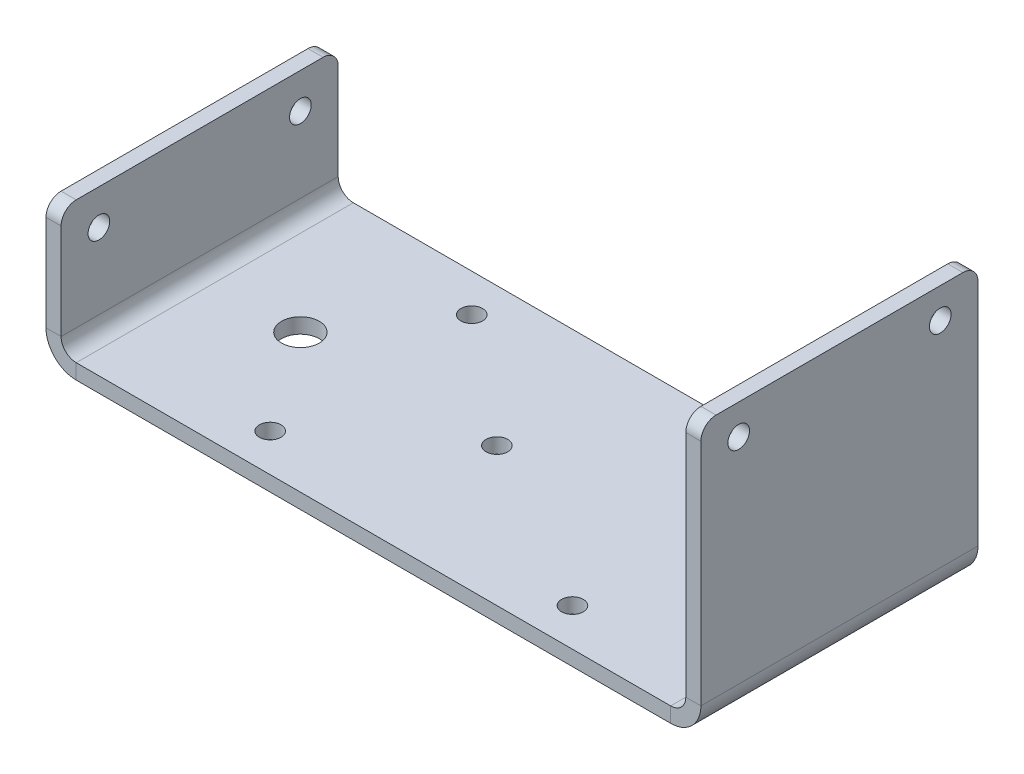
ISO-10303-21;
HEADER;
FILE_DESCRIPTION(('STEP AP214'),'2;1');
FILE_NAME('part.step','',(''),(''),'','','');
FILE_SCHEMA(('AUTOMOTIVE_DESIGN { 1 0 10303 214 1 1 1 1 }'));
ENDSEC;
DATA;
#1=APPLICATION_CONTEXT('core data for automotive mechanical design processes');
#2=APPLICATION_PROTOCOL_DEFINITION('international standard','automotive_design',2000,#1);
#3=PRODUCT_CONTEXT('',#1,'mechanical');
#4=PRODUCT('Part','Part','',(#3));
#5=PRODUCT_RELATED_PRODUCT_CATEGORY('part','',(#4));
#6=PRODUCT_DEFINITION_FORMATION('','',#4);
#7=PRODUCT_DEFINITION_CONTEXT('part definition',#1,'design');
#8=PRODUCT_DEFINITION('design','',#6,#7);
#9=PRODUCT_DEFINITION_SHAPE('','',#8);
#10=(LENGTH_UNIT() NAMED_UNIT(*) SI_UNIT(.MILLI.,.METRE.));
#11=(NAMED_UNIT(*) PLANE_ANGLE_UNIT() SI_UNIT($,.RADIAN.));
#12=(NAMED_UNIT(*) SI_UNIT($,.STERADIAN.) SOLID_ANGLE_UNIT());
#13=UNCERTAINTY_MEASURE_WITH_UNIT(LENGTH_MEASURE(1.E-05),#10,'distance_accuracy_value','');
#14=(GEOMETRIC_REPRESENTATION_CONTEXT(3) GLOBAL_UNCERTAINTY_ASSIGNED_CONTEXT((#13)) GLOBAL_UNIT_ASSIGNED_CONTEXT((#10,
#11,#12)) REPRESENTATION_CONTEXT('',''));
#15=CARTESIAN_POINT('',(0.,0.,0.));
#16=DIRECTION('',(0.,0.,1.));
#17=DIRECTION('',(1.,0.,0.));
#18=AXIS2_PLACEMENT_3D('',#15,#16,#17);
#19=CARTESIAN_POINT('',(0.,-3.,0.));
#20=DIRECTION('',(0.,-1.,0.));
#21=DIRECTION('',(0.,0.,-1.));
#22=AXIS2_PLACEMENT_3D('',#19,#20,#21);
#23=PLANE('',#22);
#24=CARTESIAN_POINT('',(35.,-3.,-20.));
#25=DIRECTION('',(0.,-1.,0.));
#26=DIRECTION('',(0.,0.,-1.));
#27=AXIS2_PLACEMENT_3D('',#24,#25,#26);
#28=CIRCLE('',#27,2.14999999999999);
#29=CARTESIAN_POINT('',(35.,-3.,-22.15));
#30=VERTEX_POINT('',#29);
#31=EDGE_CURVE('E474',#30,#30,#28,.T.);
#32=ORIENTED_EDGE('',*,*,#31,.F.);
#33=EDGE_LOOP('',(#32));
#34=FACE_BOUND('',#33,.T.);
#35=CARTESIAN_POINT('',(-25.,-3.,-20.));
#36=DIRECTION('',(0.,-1.,0.));
#37=DIRECTION('',(0.,0.,-1.));
#38=AXIS2_PLACEMENT_3D('',#35,#36,#37);
#39=CIRCLE('',#38,2.14999999999999);
#40=CARTESIAN_POINT('',(-25.,-3.,-22.15));
#41=VERTEX_POINT('',#40);
#42=EDGE_CURVE('E466',#41,#41,#39,.T.);
#43=ORIENTED_EDGE('',*,*,#42,.F.);
#44=EDGE_LOOP('',(#43));
#45=FACE_BOUND('',#44,.T.);
#46=CARTESIAN_POINT('',(-25.,-3.,20.));
#47=DIRECTION('',(0.,-1.,0.));
#48=DIRECTION('',(0.,0.,-1.));
#49=AXIS2_PLACEMENT_3D('',#46,#47,#48);
#50=CIRCLE('',#49,2.14999999999999);
#51=CARTESIAN_POINT('',(-25.,-3.,17.85));
#52=VERTEX_POINT('',#51);
#53=EDGE_CURVE('E458',#52,#52,#50,.T.);
#54=ORIENTED_EDGE('',*,*,#53,.F.);
#55=EDGE_LOOP('',(#54));
#56=FACE_BOUND('',#55,.T.);
#57=CARTESIAN_POINT('',(35.,-3.,20.));
#58=DIRECTION('',(0.,-1.,0.));
#59=DIRECTION('',(0.,0.,-1.));
#60=AXIS2_PLACEMENT_3D('',#57,#58,#59);
#61=CIRCLE('',#60,2.14999999999999);
#62=CARTESIAN_POINT('',(35.,-3.,17.85));
#63=VERTEX_POINT('',#62);
#64=EDGE_CURVE('E450',#63,#63,#61,.T.);
#65=ORIENTED_EDGE('',*,*,#64,.F.);
#66=EDGE_LOOP('',(#65));
#67=FACE_BOUND('',#66,.T.);
#68=CARTESIAN_POINT('',(0.,-3.,0.));
#69=DIRECTION('',(0.,-1.,0.));
#70=DIRECTION('',(0.,0.,-1.));
#71=AXIS2_PLACEMENT_3D('',#68,#69,#70);
#72=CIRCLE('',#71,2.14999999999999);
#73=CARTESIAN_POINT('',(0.,-3.,-2.14999999999999));
#74=VERTEX_POINT('',#73);
#75=EDGE_CURVE('E442',#74,#74,#72,.T.);
#76=ORIENTED_EDGE('',*,*,#75,.F.);
#77=EDGE_LOOP('',(#76));
#78=FACE_BOUND('',#77,.T.);
#79=CARTESIAN_POINT('',(-39.,-3.,0.));
#80=DIRECTION('',(0.,1.,0.));
#81=DIRECTION('',(0.,0.,1.));
#82=AXIS2_PLACEMENT_3D('',#79,#80,#81);
#83=CIRCLE('',#82,3.75000000000001);
#84=CARTESIAN_POINT('',(-39.,-3.,3.75000000000001));
#85=VERTEX_POINT('',#84);
#86=EDGE_CURVE('E309',#85,#85,#83,.T.);
#87=ORIENTED_EDGE('',*,*,#86,.T.);
#88=EDGE_LOOP('',(#87));
#89=FACE_BOUND('',#88,.T.);
#90=CARTESIAN_POINT('',(45.,-3.,0.));
#91=DIRECTION('',(0.,1.,0.));
#92=DIRECTION('',(0.,0.,1.));
#93=AXIS2_PLACEMENT_3D('',#90,#91,#92);
#94=CIRCLE('',#93,3.75000000000001);
#95=CARTESIAN_POINT('',(45.,-3.,3.75000000000001));
#96=VERTEX_POINT('',#95);
#97=EDGE_CURVE('E317',#96,#96,#94,.T.);
#98=ORIENTED_EDGE('',*,*,#97,.T.);
#99=EDGE_LOOP('',(#98));
#100=FACE_BOUND('',#99,.T.);
#101=DIRECTION('',(-1.,0.,0.));
#102=VECTOR('',#101,1.);
#103=CARTESIAN_POINT('',(-59.,-3.,-27.5));
#104=LINE('',#103,#102);
#105=CARTESIAN_POINT('',(62.,-3.,-27.5));
#106=VERTEX_POINT('',#105);
#107=CARTESIAN_POINT('',(-56.,-3.,-27.5));
#108=VERTEX_POINT('',#107);
#109=EDGE_CURVE('E325',#106,#108,#104,.T.);
#110=ORIENTED_EDGE('',*,*,#109,.F.);
#111=DIRECTION('',(0.,0.,-1.));
#112=VECTOR('',#111,1.);
#113=CARTESIAN_POINT('',(62.,-3.,-27.5));
#114=LINE('',#113,#112);
#115=CARTESIAN_POINT('',(62.,-3.,27.5));
#116=VERTEX_POINT('',#115);
#117=EDGE_CURVE('E174',#106,#116,#114,.F.);
#118=ORIENTED_EDGE('',*,*,#117,.T.);
#119=DIRECTION('',(1.,0.,0.));
#120=VECTOR('',#119,1.);
#121=CARTESIAN_POINT('',(-59.,-3.,27.5));
#122=LINE('',#121,#120);
#123=CARTESIAN_POINT('',(-56.,-3.,27.5));
#124=VERTEX_POINT('',#123);
#125=EDGE_CURVE('E328',#124,#116,#122,.T.);
#126=ORIENTED_EDGE('',*,*,#125,.F.);
#127=DIRECTION('',(0.,0.,1.));
#128=VECTOR('',#127,1.);
#129=CARTESIAN_POINT('',(-56.,-3.,27.5));
#130=LINE('',#129,#128);
#131=EDGE_CURVE('E277',#124,#108,#130,.F.);
#132=ORIENTED_EDGE('',*,*,#131,.T.);
#133=EDGE_LOOP('',(#110,#118,#126,#132));
#134=FACE_BOUND('',#133,.T.);
#135=ADVANCED_FACE('F51',(#34,#45,#56,#67,#78,#89,#100,#134),#23,.T.);
#136=CARTESIAN_POINT('',(0.,0.,0.));
#137=DIRECTION('',(0.,-1.,0.));
#138=DIRECTION('',(0.,0.,-1.));
#139=AXIS2_PLACEMENT_3D('',#136,#137,#138);
#140=PLANE('',#139);
#141=CARTESIAN_POINT('',(35.,0.,-20.));
#142=DIRECTION('',(0.,-1.,0.));
#143=DIRECTION('',(0.,0.,-1.));
#144=AXIS2_PLACEMENT_3D('',#141,#142,#143);
#145=CIRCLE('',#144,2.14999999999999);
#146=CARTESIAN_POINT('',(35.,0.,-22.15));
#147=VERTEX_POINT('',#146);
#148=EDGE_CURVE('E470',#147,#147,#145,.T.);
#149=ORIENTED_EDGE('',*,*,#148,.T.);
#150=EDGE_LOOP('',(#149));
#151=FACE_BOUND('',#150,.T.);
#152=CARTESIAN_POINT('',(-25.,0.,-20.));
#153=DIRECTION('',(0.,-1.,0.));
#154=DIRECTION('',(0.,0.,-1.));
#155=AXIS2_PLACEMENT_3D('',#152,#153,#154);
#156=CIRCLE('',#155,2.14999999999999);
#157=CARTESIAN_POINT('',(-25.,0.,-22.15));
#158=VERTEX_POINT('',#157);
#159=EDGE_CURVE('E462',#158,#158,#156,.T.);
#160=ORIENTED_EDGE('',*,*,#159,.T.);
#161=EDGE_LOOP('',(#160));
#162=FACE_BOUND('',#161,.T.);
#163=CARTESIAN_POINT('',(-25.,0.,20.));
#164=DIRECTION('',(0.,-1.,0.));
#165=DIRECTION('',(0.,0.,-1.));
#166=AXIS2_PLACEMENT_3D('',#163,#164,#165);
#167=CIRCLE('',#166,2.14999999999999);
#168=CARTESIAN_POINT('',(-25.,0.,17.85));
#169=VERTEX_POINT('',#168);
#170=EDGE_CURVE('E454',#169,#169,#167,.T.);
#171=ORIENTED_EDGE('',*,*,#170,.T.);
#172=EDGE_LOOP('',(#171));
#173=FACE_BOUND('',#172,.T.);
#174=CARTESIAN_POINT('',(35.,0.,20.));
#175=DIRECTION('',(0.,-1.,0.));
#176=DIRECTION('',(0.,0.,-1.));
#177=AXIS2_PLACEMENT_3D('',#174,#175,#176);
#178=CIRCLE('',#177,2.14999999999999);
#179=CARTESIAN_POINT('',(35.,0.,17.85));
#180=VERTEX_POINT('',#179);
#181=EDGE_CURVE('E446',#180,#180,#178,.T.);
#182=ORIENTED_EDGE('',*,*,#181,.T.);
#183=EDGE_LOOP('',(#182));
#184=FACE_BOUND('',#183,.T.);
#185=CARTESIAN_POINT('',(0.,0.,0.));
#186=DIRECTION('',(0.,-1.,0.));
#187=DIRECTION('',(0.,0.,-1.));
#188=AXIS2_PLACEMENT_3D('',#185,#186,#187);
#189=CIRCLE('',#188,2.14999999999999);
#190=CARTESIAN_POINT('',(0.,0.,-2.14999999999999));
#191=VERTEX_POINT('',#190);
#192=EDGE_CURVE('E438',#191,#191,#189,.T.);
#193=ORIENTED_EDGE('',*,*,#192,.T.);
#194=EDGE_LOOP('',(#193));
#195=FACE_BOUND('',#194,.T.);
#196=CARTESIAN_POINT('',(-39.,0.,0.));
#197=DIRECTION('',(0.,1.,0.));
#198=DIRECTION('',(0.,0.,1.));
#199=AXIS2_PLACEMENT_3D('',#196,#197,#198);
#200=CIRCLE('',#199,3.75000000000001);
#201=CARTESIAN_POINT('',(-39.,0.,3.75000000000001));
#202=VERTEX_POINT('',#201);
#203=EDGE_CURVE('E305',#202,#202,#200,.T.);
#204=ORIENTED_EDGE('',*,*,#203,.F.);
#205=EDGE_LOOP('',(#204));
#206=FACE_BOUND('',#205,.T.);
#207=CARTESIAN_POINT('',(45.,0.,0.));
#208=DIRECTION('',(0.,1.,0.));
#209=DIRECTION('',(0.,0.,1.));
#210=AXIS2_PLACEMENT_3D('',#207,#208,#209);
#211=CIRCLE('',#210,3.75000000000001);
#212=CARTESIAN_POINT('',(45.,0.,3.75000000000001));
#213=VERTEX_POINT('',#212);
#214=EDGE_CURVE('E313',#213,#213,#211,.T.);
#215=ORIENTED_EDGE('',*,*,#214,.F.);
#216=EDGE_LOOP('',(#215));
#217=FACE_BOUND('',#216,.T.);
#218=DIRECTION('',(0.,0.,-1.));
#219=VECTOR('',#218,1.);
#220=CARTESIAN_POINT('',(62.,0.,-27.5));
#221=LINE('',#220,#219);
#222=CARTESIAN_POINT('',(62.,0.,-27.5));
#223=VERTEX_POINT('',#222);
#224=CARTESIAN_POINT('',(62.,0.,27.5));
#225=VERTEX_POINT('',#224);
#226=EDGE_CURVE('E228',#223,#225,#221,.F.);
#227=ORIENTED_EDGE('',*,*,#226,.F.);
#228=DIRECTION('',(-1.,0.,0.));
#229=VECTOR('',#228,1.);
#230=CARTESIAN_POINT('',(-59.,0.,-27.5));
#231=LINE('',#230,#229);
#232=CARTESIAN_POINT('',(-56.,0.,-27.5));
#233=VERTEX_POINT('',#232);
#234=EDGE_CURVE('E321',#223,#233,#231,.T.);
#235=ORIENTED_EDGE('',*,*,#234,.T.);
#236=DIRECTION('',(0.,0.,1.));
#237=VECTOR('',#236,1.);
#238=CARTESIAN_POINT('',(-56.,0.,27.5));
#239=LINE('',#238,#237);
#240=CARTESIAN_POINT('',(-56.,0.,27.5));
#241=VERTEX_POINT('',#240);
#242=EDGE_CURVE('E294',#241,#233,#239,.F.);
#243=ORIENTED_EDGE('',*,*,#242,.F.);
#244=DIRECTION('',(1.,0.,0.));
#245=VECTOR('',#244,1.);
#246=CARTESIAN_POINT('',(-59.,0.,27.5));
#247=LINE('',#246,#245);
#248=EDGE_CURVE('E329',#241,#225,#247,.T.);
#249=ORIENTED_EDGE('',*,*,#248,.T.);
#250=EDGE_LOOP('',(#227,#235,#243,#249));
#251=FACE_BOUND('',#250,.T.);
#252=ADVANCED_FACE('F484',(#151,#162,#173,#184,#195,#206,#217,#251),#140,.F.);
#253=CARTESIAN_POINT('',(-59.,-3.,-27.5));
#254=DIRECTION('',(0.,0.,-1.));
#255=DIRECTION('',(-1.,0.,0.));
#256=AXIS2_PLACEMENT_3D('',#253,#254,#255);
#257=PLANE('',#256);
#258=ORIENTED_EDGE('',*,*,#234,.F.);
#259=DIRECTION('',(0.,-1.,0.));
#260=VECTOR('',#259,1.);
#261=CARTESIAN_POINT('',(62.,0.,-27.5));
#262=LINE('',#261,#260);
#263=EDGE_CURVE('E223',#223,#106,#262,.T.);
#264=ORIENTED_EDGE('',*,*,#263,.T.);
#265=ORIENTED_EDGE('',*,*,#109,.T.);
#266=DIRECTION('',(0.,-1.,0.));
#267=VECTOR('',#266,1.);
#268=CARTESIAN_POINT('',(-56.,0.,-27.5));
#269=LINE('',#268,#267);
#270=EDGE_CURVE('E301',#233,#108,#269,.T.);
#271=ORIENTED_EDGE('',*,*,#270,.F.);
#272=EDGE_LOOP('',(#258,#264,#265,#271));
#273=FACE_BOUND('',#272,.T.);
#274=ADVANCED_FACE('F504',(#273),#257,.T.);
#275=CARTESIAN_POINT('',(-59.,-3.,27.5));
#276=DIRECTION('',(0.,0.,1.));
#277=DIRECTION('',(1.,0.,0.));
#278=AXIS2_PLACEMENT_3D('',#275,#276,#277);
#279=PLANE('',#278);
#280=DIRECTION('',(0.,-1.,0.));
#281=VECTOR('',#280,1.);
#282=CARTESIAN_POINT('',(62.,0.,27.5));
#283=LINE('',#282,#281);
#284=EDGE_CURVE('E233',#225,#116,#283,.T.);
#285=ORIENTED_EDGE('',*,*,#284,.F.);
#286=ORIENTED_EDGE('',*,*,#248,.F.);
#287=DIRECTION('',(0.,-1.,0.));
#288=VECTOR('',#287,1.);
#289=CARTESIAN_POINT('',(-56.,0.,27.5));
#290=LINE('',#289,#288);
#291=EDGE_CURVE('E286',#241,#124,#290,.T.);
#292=ORIENTED_EDGE('',*,*,#291,.T.);
#293=ORIENTED_EDGE('',*,*,#125,.T.);
#294=EDGE_LOOP('',(#285,#286,#292,#293));
#295=FACE_BOUND('',#294,.T.);
#296=ADVANCED_FACE('F571',(#295),#279,.T.);
#297=CARTESIAN_POINT('',(45.,-3.,0.));
#298=DIRECTION('',(0.,1.,0.));
#299=DIRECTION('',(0.,0.,1.));
#300=AXIS2_PLACEMENT_3D('',#297,#298,#299);
#301=CYLINDRICAL_SURFACE('',#300,3.75000000000001);
#302=ORIENTED_EDGE('',*,*,#97,.F.);
#303=EDGE_LOOP('',(#302));
#304=FACE_BOUND('',#303,.T.);
#305=ORIENTED_EDGE('',*,*,#214,.T.);
#306=EDGE_LOOP('',(#305));
#307=FACE_BOUND('',#306,.T.);
#308=ADVANCED_FACE('F568',(#304,#307),#301,.F.);
#309=CARTESIAN_POINT('',(-39.,-3.,0.));
#310=DIRECTION('',(0.,1.,0.));
#311=DIRECTION('',(0.,0.,1.));
#312=AXIS2_PLACEMENT_3D('',#309,#310,#311);
#313=CYLINDRICAL_SURFACE('',#312,3.75000000000001);
#314=ORIENTED_EDGE('',*,*,#86,.F.);
#315=EDGE_LOOP('',(#314));
#316=FACE_BOUND('',#315,.T.);
#317=ORIENTED_EDGE('',*,*,#203,.T.);
#318=EDGE_LOOP('',(#317));
#319=FACE_BOUND('',#318,.T.);
#320=ADVANCED_FACE('F562',(#316,#319),#313,.F.);
#321=CARTESIAN_POINT('',(-56.,3.,-27.5));
#322=DIRECTION('',(0.,0.,-1.));
#323=DIRECTION('',(-1.,0.,0.));
#324=AXIS2_PLACEMENT_3D('',#321,#322,#323);
#325=PLANE('',#324);
#326=DIRECTION('',(-1.,0.,0.));
#327=VECTOR('',#326,1.);
#328=CARTESIAN_POINT('',(-59.,2.99999999999999,-27.5));
#329=LINE('',#328,#327);
#330=CARTESIAN_POINT('',(-59.,2.99999999999999,-27.5));
#331=VERTEX_POINT('',#330);
#332=CARTESIAN_POINT('',(-62.,2.99999999999998,-27.5));
#333=VERTEX_POINT('',#332);
#334=EDGE_CURVE('E237',#331,#333,#329,.T.);
#335=ORIENTED_EDGE('',*,*,#334,.F.);
#336=CARTESIAN_POINT('',(-56.,3.,-27.5));
#337=DIRECTION('',(0.,0.,1.));
#338=DIRECTION('',(1.,0.,0.));
#339=AXIS2_PLACEMENT_3D('',#336,#337,#338);
#340=CIRCLE('',#339,3.);
#341=EDGE_CURVE('E290',#233,#331,#340,.F.);
#342=ORIENTED_EDGE('',*,*,#341,.F.);
#343=ORIENTED_EDGE('',*,*,#270,.T.);
#344=CARTESIAN_POINT('',(-56.,3.,-27.5));
#345=DIRECTION('',(0.,0.,1.));
#346=DIRECTION('',(1.,0.,0.));
#347=AXIS2_PLACEMENT_3D('',#344,#345,#346);
#348=CIRCLE('',#347,6.);
#349=EDGE_CURVE('E281',#108,#333,#348,.F.);
#350=ORIENTED_EDGE('',*,*,#349,.T.);
#351=EDGE_LOOP('',(#335,#342,#343,#350));
#352=FACE_BOUND('',#351,.T.);
#353=ADVANCED_FACE('F511',(#352),#325,.T.);
#354=CARTESIAN_POINT('',(-56.,3.,27.5));
#355=DIRECTION('',(0.,0.,-1.));
#356=DIRECTION('',(-1.,0.,0.));
#357=AXIS2_PLACEMENT_3D('',#354,#355,#356);
#358=PLANE('',#357);
#359=CARTESIAN_POINT('',(-56.,3.,27.5));
#360=DIRECTION('',(0.,0.,1.));
#361=DIRECTION('',(1.,0.,0.));
#362=AXIS2_PLACEMENT_3D('',#359,#360,#361);
#363=CIRCLE('',#362,3.);
#364=CARTESIAN_POINT('',(-59.,2.99999999999999,27.5));
#365=VERTEX_POINT('',#364);
#366=EDGE_CURVE('E267',#365,#241,#363,.T.);
#367=ORIENTED_EDGE('',*,*,#366,.F.);
#368=DIRECTION('',(-1.,0.,0.));
#369=VECTOR('',#368,1.);
#370=CARTESIAN_POINT('',(-59.,2.99999999999999,27.5));
#371=LINE('',#370,#369);
#372=CARTESIAN_POINT('',(-62.0000000000001,2.99999999999998,27.5));
#373=VERTEX_POINT('',#372);
#374=EDGE_CURVE('E243',#365,#373,#371,.T.);
#375=ORIENTED_EDGE('',*,*,#374,.T.);
#376=CARTESIAN_POINT('',(-56.,3.,27.5));
#377=DIRECTION('',(0.,0.,1.));
#378=DIRECTION('',(1.,0.,0.));
#379=AXIS2_PLACEMENT_3D('',#376,#377,#378);
#380=CIRCLE('',#379,6.);
#381=EDGE_CURVE('E282',#373,#124,#380,.T.);
#382=ORIENTED_EDGE('',*,*,#381,.T.);
#383=ORIENTED_EDGE('',*,*,#291,.F.);
#384=EDGE_LOOP('',(#367,#375,#382,#383));
#385=FACE_BOUND('',#384,.T.);
#386=ADVANCED_FACE('F557',(#385),#358,.F.);
#387=CARTESIAN_POINT('',(-56.,3.,27.5));
#388=DIRECTION('',(0.,0.,1.));
#389=DIRECTION('',(-1.,0.,0.));
#390=AXIS2_PLACEMENT_3D('',#387,#388,#389);
#391=CYLINDRICAL_SURFACE('',#390,6.);
#392=ORIENTED_EDGE('',*,*,#131,.F.);
#393=ORIENTED_EDGE('',*,*,#381,.F.);
#394=DIRECTION('',(0.,0.,-1.));
#395=VECTOR('',#394,1.);
#396=CARTESIAN_POINT('',(-62.,2.99999999999998,0.));
#397=LINE('',#396,#395);
#398=EDGE_CURVE('E247',#373,#333,#397,.T.);
#399=ORIENTED_EDGE('',*,*,#398,.T.);
#400=ORIENTED_EDGE('',*,*,#349,.F.);
#401=EDGE_LOOP('',(#392,#393,#399,#400));
#402=FACE_BOUND('',#401,.T.);
#403=ADVANCED_FACE('F506',(#402),#391,.T.);
#404=CARTESIAN_POINT('',(-56.,3.,27.5));
#405=DIRECTION('',(0.,0.,1.));
#406=DIRECTION('',(-1.,0.,0.));
#407=AXIS2_PLACEMENT_3D('',#404,#405,#406);
#408=CYLINDRICAL_SURFACE('',#407,3.);
#409=ORIENTED_EDGE('',*,*,#242,.T.);
#410=ORIENTED_EDGE('',*,*,#341,.T.);
#411=DIRECTION('',(0.,0.,1.));
#412=VECTOR('',#411,1.);
#413=CARTESIAN_POINT('',(-59.,2.99999999999999,-27.5));
#414=LINE('',#413,#412);
#415=EDGE_CURVE('E240',#331,#365,#414,.T.);
#416=ORIENTED_EDGE('',*,*,#415,.T.);
#417=ORIENTED_EDGE('',*,*,#366,.T.);
#418=EDGE_LOOP('',(#409,#410,#416,#417));
#419=FACE_BOUND('',#418,.T.);
#420=ADVANCED_FACE('F514',(#419),#408,.F.);
#421=CARTESIAN_POINT('',(-62.,-2.23359708988403E-13,0.));
#422=DIRECTION('',(1.,0.,0.));
#423=DIRECTION('',(0.,1.,0.));
#424=AXIS2_PLACEMENT_3D('',#421,#422,#423);
#425=PLANE('',#424);
#426=CARTESIAN_POINT('',(-62.0000000000001,18.,-20.));
#427=DIRECTION('',(-1.,0.,0.));
#428=DIRECTION('',(0.,0.,1.));
#429=AXIS2_PLACEMENT_3D('',#426,#427,#428);
#430=CIRCLE('',#429,2.15);
#431=CARTESIAN_POINT('',(-62.0000000000001,18.,-17.85));
#432=VERTEX_POINT('',#431);
#433=EDGE_CURVE('E434',#432,#432,#430,.T.);
#434=ORIENTED_EDGE('',*,*,#433,.F.);
#435=EDGE_LOOP('',(#434));
#436=FACE_BOUND('',#435,.T.);
#437=CARTESIAN_POINT('',(-62.0000000000001,18.,20.));
#438=DIRECTION('',(-1.,0.,0.));
#439=DIRECTION('',(0.,0.,1.));
#440=AXIS2_PLACEMENT_3D('',#437,#438,#439);
#441=CIRCLE('',#440,2.15);
#442=CARTESIAN_POINT('',(-62.0000000000001,18.,22.15));
#443=VERTEX_POINT('',#442);
#444=EDGE_CURVE('E426',#443,#443,#441,.T.);
#445=ORIENTED_EDGE('',*,*,#444,.F.);
#446=EDGE_LOOP('',(#445));
#447=FACE_BOUND('',#446,.T.);
#448=DIRECTION('',(0.,1.,0.));
#449=VECTOR('',#448,1.);
#450=CARTESIAN_POINT('',(-62.0000000000001,25.,27.5));
#451=LINE('',#450,#449);
#452=CARTESIAN_POINT('',(-62.0000000000001,22.,27.5));
#453=VERTEX_POINT('',#452);
#454=EDGE_CURVE('E258',#373,#453,#451,.T.);
#455=ORIENTED_EDGE('',*,*,#454,.T.);
#456=CARTESIAN_POINT('',(-62.0000000000001,22.,24.5));
#457=DIRECTION('',(1.,0.,0.));
#458=DIRECTION('',(0.,1.,0.));
#459=AXIS2_PLACEMENT_3D('',#456,#457,#458);
#460=CIRCLE('',#459,3.);
#461=CARTESIAN_POINT('',(-62.0000000000001,25.,24.5));
#462=VERTEX_POINT('',#461);
#463=EDGE_CURVE('E367',#453,#462,#460,.F.);
#464=ORIENTED_EDGE('',*,*,#463,.T.);
#465=DIRECTION('',(0.,0.,-1.));
#466=VECTOR('',#465,1.);
#467=CARTESIAN_POINT('',(-62.0000000000001,25.,-27.5));
#468=LINE('',#467,#466);
#469=CARTESIAN_POINT('',(-62.0000000000001,25.,-24.5));
#470=VERTEX_POINT('',#469);
#471=EDGE_CURVE('E263',#462,#470,#468,.T.);
#472=ORIENTED_EDGE('',*,*,#471,.T.);
#473=CARTESIAN_POINT('',(-62.0000000000001,22.,-24.5));
#474=DIRECTION('',(1.,0.,0.));
#475=DIRECTION('',(0.,1.,0.));
#476=AXIS2_PLACEMENT_3D('',#473,#474,#475);
#477=CIRCLE('',#476,3.);
#478=CARTESIAN_POINT('',(-62.0000000000001,22.,-27.5));
#479=VERTEX_POINT('',#478);
#480=EDGE_CURVE('E364',#470,#479,#477,.F.);
#481=ORIENTED_EDGE('',*,*,#480,.T.);
#482=DIRECTION('',(0.,-1.,0.));
#483=VECTOR('',#482,1.);
#484=CARTESIAN_POINT('',(-62.,0.,-27.5));
#485=LINE('',#484,#483);
#486=EDGE_CURVE('E255',#479,#333,#485,.T.);
#487=ORIENTED_EDGE('',*,*,#486,.T.);
#488=ORIENTED_EDGE('',*,*,#398,.F.);
#489=EDGE_LOOP('',(#455,#464,#472,#481,#487,#488));
#490=FACE_BOUND('',#489,.T.);
#491=ADVANCED_FACE('F533',(#436,#447,#490),#425,.F.);
#492=CARTESIAN_POINT('',(-59.,-2.12885264971874E-13,0.));
#493=DIRECTION('',(1.,0.,0.));
#494=DIRECTION('',(0.,1.,0.));
#495=AXIS2_PLACEMENT_3D('',#492,#493,#494);
#496=PLANE('',#495);
#497=CARTESIAN_POINT('',(-59.0000000000001,18.,-20.));
#498=DIRECTION('',(1.,0.,0.));
#499=DIRECTION('',(0.,1.,0.));
#500=AXIS2_PLACEMENT_3D('',#497,#498,#499);
#501=CIRCLE('',#500,2.15);
#502=CARTESIAN_POINT('',(-59.0000000000001,20.15,-20.));
#503=VERTEX_POINT('',#502);
#504=EDGE_CURVE('E430',#503,#503,#501,.F.);
#505=ORIENTED_EDGE('',*,*,#504,.T.);
#506=EDGE_LOOP('',(#505));
#507=FACE_BOUND('',#506,.T.);
#508=CARTESIAN_POINT('',(-59.0000000000001,18.,20.));
#509=DIRECTION('',(1.,0.,0.));
#510=DIRECTION('',(0.,1.,0.));
#511=AXIS2_PLACEMENT_3D('',#508,#509,#510);
#512=CIRCLE('',#511,2.15);
#513=CARTESIAN_POINT('',(-59.0000000000001,20.15,20.));
#514=VERTEX_POINT('',#513);
#515=EDGE_CURVE('E422',#514,#514,#512,.F.);
#516=ORIENTED_EDGE('',*,*,#515,.T.);
#517=EDGE_LOOP('',(#516));
#518=FACE_BOUND('',#517,.T.);
#519=DIRECTION('',(0.,0.,-1.));
#520=VECTOR('',#519,1.);
#521=CARTESIAN_POINT('',(-59.0000000000001,25.,-27.5));
#522=LINE('',#521,#520);
#523=CARTESIAN_POINT('',(-59.0000000000001,25.,24.5));
#524=VERTEX_POINT('',#523);
#525=CARTESIAN_POINT('',(-59.0000000000001,25.,-24.5));
#526=VERTEX_POINT('',#525);
#527=EDGE_CURVE('E259',#524,#526,#522,.T.);
#528=ORIENTED_EDGE('',*,*,#527,.F.);
#529=CARTESIAN_POINT('',(-59.0000000000001,22.,24.5));
#530=DIRECTION('',(1.,0.,0.));
#531=DIRECTION('',(0.,1.,0.));
#532=AXIS2_PLACEMENT_3D('',#529,#530,#531);
#533=CIRCLE('',#532,3.);
#534=CARTESIAN_POINT('',(-59.0000000000001,22.,27.5));
#535=VERTEX_POINT('',#534);
#536=EDGE_CURVE('E358',#524,#535,#533,.T.);
#537=ORIENTED_EDGE('',*,*,#536,.T.);
#538=DIRECTION('',(0.,1.,0.));
#539=VECTOR('',#538,1.);
#540=CARTESIAN_POINT('',(-59.0000000000001,25.,27.5));
#541=LINE('',#540,#539);
#542=EDGE_CURVE('E270',#365,#535,#541,.T.);
#543=ORIENTED_EDGE('',*,*,#542,.F.);
#544=ORIENTED_EDGE('',*,*,#415,.F.);
#545=DIRECTION('',(0.,-1.,0.));
#546=VECTOR('',#545,1.);
#547=CARTESIAN_POINT('',(-59.,0.,-27.5));
#548=LINE('',#547,#546);
#549=CARTESIAN_POINT('',(-59.0000000000001,22.,-27.5));
#550=VERTEX_POINT('',#549);
#551=EDGE_CURVE('E254',#550,#331,#548,.T.);
#552=ORIENTED_EDGE('',*,*,#551,.F.);
#553=CARTESIAN_POINT('',(-59.0000000000001,22.,-24.5));
#554=DIRECTION('',(1.,0.,0.));
#555=DIRECTION('',(0.,1.,0.));
#556=AXIS2_PLACEMENT_3D('',#553,#554,#555);
#557=CIRCLE('',#556,3.);
#558=EDGE_CURVE('E355',#550,#526,#557,.T.);
#559=ORIENTED_EDGE('',*,*,#558,.T.);
#560=EDGE_LOOP('',(#528,#537,#543,#544,#552,#559));
#561=FACE_BOUND('',#560,.T.);
#562=ADVANCED_FACE('F521',(#507,#518,#561),#496,.T.);
#563=CARTESIAN_POINT('',(-62.,0.,-27.5));
#564=DIRECTION('',(0.,0.,1.));
#565=DIRECTION('',(1.,0.,0.));
#566=AXIS2_PLACEMENT_3D('',#563,#564,#565);
#567=PLANE('',#566);
#568=ORIENTED_EDGE('',*,*,#486,.F.);
#569=DIRECTION('',(1.,0.,0.));
#570=VECTOR('',#569,1.);
#571=CARTESIAN_POINT('',(-62.0000000000001,22.,-27.5));
#572=LINE('',#571,#570);
#573=EDGE_CURVE('E370',#479,#550,#572,.T.);
#574=ORIENTED_EDGE('',*,*,#573,.T.);
#575=ORIENTED_EDGE('',*,*,#551,.T.);
#576=ORIENTED_EDGE('',*,*,#334,.T.);
#577=EDGE_LOOP('',(#568,#574,#575,#576));
#578=FACE_BOUND('',#577,.T.);
#579=ADVANCED_FACE('F543',(#578),#567,.F.);
#580=CARTESIAN_POINT('',(-62.0000000000001,25.,27.5));
#581=DIRECTION('',(0.,0.,-1.));
#582=DIRECTION('',(0.,1.,0.));
#583=AXIS2_PLACEMENT_3D('',#580,#581,#582);
#584=PLANE('',#583);
#585=ORIENTED_EDGE('',*,*,#542,.T.);
#586=DIRECTION('',(1.,0.,0.));
#587=VECTOR('',#586,1.);
#588=CARTESIAN_POINT('',(-62.0000000000001,22.,27.5));
#589=LINE('',#588,#587);
#590=EDGE_CURVE('E361',#535,#453,#589,.F.);
#591=ORIENTED_EDGE('',*,*,#590,.T.);
#592=ORIENTED_EDGE('',*,*,#454,.F.);
#593=ORIENTED_EDGE('',*,*,#374,.F.);
#594=EDGE_LOOP('',(#585,#591,#592,#593));
#595=FACE_BOUND('',#594,.T.);
#596=ADVANCED_FACE('F525',(#595),#584,.F.);
#597=CARTESIAN_POINT('',(-62.0000000000001,25.,-27.5));
#598=DIRECTION('',(0.,-1.,0.));
#599=DIRECTION('',(1.,0.,0.));
#600=AXIS2_PLACEMENT_3D('',#597,#598,#599);
#601=PLANE('',#600);
#602=ORIENTED_EDGE('',*,*,#471,.F.);
#603=DIRECTION('',(1.,0.,0.));
#604=VECTOR('',#603,1.);
#605=CARTESIAN_POINT('',(-62.0000000000001,25.,24.5));
#606=LINE('',#605,#604);
#607=EDGE_CURVE('E351',#462,#524,#606,.T.);
#608=ORIENTED_EDGE('',*,*,#607,.T.);
#609=ORIENTED_EDGE('',*,*,#527,.T.);
#610=DIRECTION('',(1.,0.,0.));
#611=VECTOR('',#610,1.);
#612=CARTESIAN_POINT('',(-62.0000000000001,25.,-24.5));
#613=LINE('',#612,#611);
#614=EDGE_CURVE('E333',#526,#470,#613,.F.);
#615=ORIENTED_EDGE('',*,*,#614,.T.);
#616=EDGE_LOOP('',(#602,#608,#609,#615));
#617=FACE_BOUND('',#616,.T.);
#618=ADVANCED_FACE('F536',(#617),#601,.F.);
#619=CARTESIAN_POINT('',(62.,3.,27.5));
#620=DIRECTION('',(0.,0.,1.));
#621=DIRECTION('',(1.,0.,0.));
#622=AXIS2_PLACEMENT_3D('',#619,#620,#621);
#623=PLANE('',#622);
#624=DIRECTION('',(1.,0.,0.));
#625=VECTOR('',#624,1.);
#626=CARTESIAN_POINT('',(65.,2.99999999999999,27.5));
#627=LINE('',#626,#625);
#628=CARTESIAN_POINT('',(65.,2.99999999999999,27.5));
#629=VERTEX_POINT('',#628);
#630=CARTESIAN_POINT('',(68.,2.99999999999998,27.5));
#631=VERTEX_POINT('',#630);
#632=EDGE_CURVE('E209',#629,#631,#627,.T.);
#633=ORIENTED_EDGE('',*,*,#632,.F.);
#634=CARTESIAN_POINT('',(62.,3.,27.5));
#635=DIRECTION('',(0.,0.,-1.));
#636=DIRECTION('',(-1.,0.,0.));
#637=AXIS2_PLACEMENT_3D('',#634,#635,#636);
#638=CIRCLE('',#637,3.);
#639=EDGE_CURVE('E178',#225,#629,#638,.F.);
#640=ORIENTED_EDGE('',*,*,#639,.F.);
#641=ORIENTED_EDGE('',*,*,#284,.T.);
#642=CARTESIAN_POINT('',(62.,3.,27.5));
#643=DIRECTION('',(0.,0.,-1.));
#644=DIRECTION('',(-1.,0.,0.));
#645=AXIS2_PLACEMENT_3D('',#642,#643,#644);
#646=CIRCLE('',#645,6.);
#647=EDGE_CURVE('E221',#116,#631,#646,.F.);
#648=ORIENTED_EDGE('',*,*,#647,.T.);
#649=EDGE_LOOP('',(#633,#640,#641,#648));
#650=FACE_BOUND('',#649,.T.);
#651=ADVANCED_FACE('F774',(#650),#623,.T.);
#652=CARTESIAN_POINT('',(62.,3.,-27.5));
#653=DIRECTION('',(0.,0.,1.));
#654=DIRECTION('',(1.,0.,0.));
#655=AXIS2_PLACEMENT_3D('',#652,#653,#654);
#656=PLANE('',#655);
#657=CARTESIAN_POINT('',(62.,3.,-27.5));
#658=DIRECTION('',(0.,0.,-1.));
#659=DIRECTION('',(-1.,0.,0.));
#660=AXIS2_PLACEMENT_3D('',#657,#658,#659);
#661=CIRCLE('',#660,3.);
#662=CARTESIAN_POINT('',(65.,2.99999999999999,-27.5));
#663=VERTEX_POINT('',#662);
#664=EDGE_CURVE('E185',#663,#223,#661,.T.);
#665=ORIENTED_EDGE('',*,*,#664,.F.);
#666=DIRECTION('',(1.,0.,0.));
#667=VECTOR('',#666,1.);
#668=CARTESIAN_POINT('',(65.,2.99999999999999,-27.5));
#669=LINE('',#668,#667);
#670=CARTESIAN_POINT('',(68.0000000000002,2.99999999999998,-27.5));
#671=VERTEX_POINT('',#670);
#672=EDGE_CURVE('E182',#663,#671,#669,.T.);
#673=ORIENTED_EDGE('',*,*,#672,.T.);
#674=CARTESIAN_POINT('',(62.,3.,-27.5));
#675=DIRECTION('',(0.,0.,-1.));
#676=DIRECTION('',(-1.,0.,0.));
#677=AXIS2_PLACEMENT_3D('',#674,#675,#676);
#678=CIRCLE('',#677,6.);
#679=EDGE_CURVE('E167',#671,#106,#678,.T.);
#680=ORIENTED_EDGE('',*,*,#679,.T.);
#681=ORIENTED_EDGE('',*,*,#263,.F.);
#682=EDGE_LOOP('',(#665,#673,#680,#681));
#683=FACE_BOUND('',#682,.T.);
#684=ADVANCED_FACE('F183',(#683),#656,.F.);
#685=CARTESIAN_POINT('',(62.,3.,-27.5));
#686=DIRECTION('',(0.,0.,-1.));
#687=DIRECTION('',(1.,0.,0.));
#688=AXIS2_PLACEMENT_3D('',#685,#686,#687);
#689=CYLINDRICAL_SURFACE('',#688,6.);
#690=ORIENTED_EDGE('',*,*,#117,.F.);
#691=ORIENTED_EDGE('',*,*,#679,.F.);
#692=DIRECTION('',(0.,0.,1.));
#693=VECTOR('',#692,1.);
#694=CARTESIAN_POINT('',(68.,2.99999999999998,0.));
#695=LINE('',#694,#693);
#696=EDGE_CURVE('E171',#671,#631,#695,.T.);
#697=ORIENTED_EDGE('',*,*,#696,.T.);
#698=ORIENTED_EDGE('',*,*,#647,.F.);
#699=EDGE_LOOP('',(#690,#691,#697,#698));
#700=FACE_BOUND('',#699,.T.);
#701=ADVANCED_FACE('F169',(#700),#689,.T.);
#702=CARTESIAN_POINT('',(62.,3.,-27.5));
#703=DIRECTION('',(0.,0.,-1.));
#704=DIRECTION('',(1.,0.,0.));
#705=AXIS2_PLACEMENT_3D('',#702,#703,#704);
#706=CYLINDRICAL_SURFACE('',#705,3.);
#707=ORIENTED_EDGE('',*,*,#226,.T.);
#708=ORIENTED_EDGE('',*,*,#639,.T.);
#709=DIRECTION('',(0.,0.,-1.));
#710=VECTOR('',#709,1.);
#711=CARTESIAN_POINT('',(65.,2.99999999999999,27.5));
#712=LINE('',#711,#710);
#713=EDGE_CURVE('E188',#629,#663,#712,.T.);
#714=ORIENTED_EDGE('',*,*,#713,.T.);
#715=ORIENTED_EDGE('',*,*,#664,.T.);
#716=EDGE_LOOP('',(#707,#708,#714,#715));
#717=FACE_BOUND('',#716,.T.);
#718=ADVANCED_FACE('F745',(#717),#706,.F.);
#719=CARTESIAN_POINT('',(68.,-2.38177952707854E-13,0.));
#720=DIRECTION('',(-1.,0.,0.));
#721=DIRECTION('',(0.,-1.,0.));
#722=AXIS2_PLACEMENT_3D('',#719,#720,#721);
#723=PLANE('',#722);
#724=CARTESIAN_POINT('',(68.0000000000002,45.5,20.));
#725=DIRECTION('',(1.,0.,0.));
#726=DIRECTION('',(0.,0.,-1.));
#727=AXIS2_PLACEMENT_3D('',#724,#725,#726);
#728=CIRCLE('',#727,2.14999999999999);
#729=CARTESIAN_POINT('',(68.0000000000002,45.5,17.85));
#730=VERTEX_POINT('',#729);
#731=EDGE_CURVE('E348',#730,#730,#728,.T.);
#732=ORIENTED_EDGE('',*,*,#731,.F.);
#733=EDGE_LOOP('',(#732));
#734=FACE_BOUND('',#733,.T.);
#735=CARTESIAN_POINT('',(68.0000000000002,45.5,-20.));
#736=DIRECTION('',(1.,0.,0.));
#737=DIRECTION('',(0.,0.,-1.));
#738=AXIS2_PLACEMENT_3D('',#735,#736,#737);
#739=CIRCLE('',#738,2.14999999999999);
#740=CARTESIAN_POINT('',(68.0000000000002,45.5,-22.15));
#741=VERTEX_POINT('',#740);
#742=EDGE_CURVE('E343',#741,#741,#739,.T.);
#743=ORIENTED_EDGE('',*,*,#742,.F.);
#744=EDGE_LOOP('',(#743));
#745=FACE_BOUND('',#744,.T.);
#746=DIRECTION('',(0.,0.,1.));
#747=VECTOR('',#746,1.);
#748=CARTESIAN_POINT('',(68.0000000000002,51.5,27.5));
#749=LINE('',#748,#747);
#750=CARTESIAN_POINT('',(68.0000000000002,51.5,-24.5));
#751=VERTEX_POINT('',#750);
#752=CARTESIAN_POINT('',(68.0000000000002,51.5,24.5));
#753=VERTEX_POINT('',#752);
#754=EDGE_CURVE('E195',#751,#753,#749,.T.);
#755=ORIENTED_EDGE('',*,*,#754,.T.);
#756=CARTESIAN_POINT('',(68.0000000000002,48.5,24.5));
#757=DIRECTION('',(-1.,0.,0.));
#758=DIRECTION('',(0.,-1.,0.));
#759=AXIS2_PLACEMENT_3D('',#756,#757,#758);
#760=CIRCLE('',#759,3.);
#761=CARTESIAN_POINT('',(68.0000000000002,48.5,27.5));
#762=VERTEX_POINT('',#761);
#763=EDGE_CURVE('E60',#753,#762,#760,.F.);
#764=ORIENTED_EDGE('',*,*,#763,.T.);
#765=DIRECTION('',(0.,-1.,0.));
#766=VECTOR('',#765,1.);
#767=CARTESIAN_POINT('',(68.,0.,27.5));
#768=LINE('',#767,#766);
#769=EDGE_CURVE('E196',#762,#631,#768,.T.);
#770=ORIENTED_EDGE('',*,*,#769,.T.);
#771=ORIENTED_EDGE('',*,*,#696,.F.);
#772=DIRECTION('',(0.,1.,0.));
#773=VECTOR('',#772,1.);
#774=CARTESIAN_POINT('',(68.0000000000002,51.5,-27.5));
#775=LINE('',#774,#773);
#776=CARTESIAN_POINT('',(68.0000000000002,48.5,-27.5));
#777=VERTEX_POINT('',#776);
#778=EDGE_CURVE('E190',#671,#777,#775,.T.);
#779=ORIENTED_EDGE('',*,*,#778,.T.);
#780=CARTESIAN_POINT('',(68.0000000000002,48.5,-24.5));
#781=DIRECTION('',(-1.,0.,0.));
#782=DIRECTION('',(0.,-1.,0.));
#783=AXIS2_PLACEMENT_3D('',#780,#781,#782);
#784=CIRCLE('',#783,3.);
#785=EDGE_CURVE('E390',#777,#751,#784,.F.);
#786=ORIENTED_EDGE('',*,*,#785,.T.);
#787=EDGE_LOOP('',(#755,#764,#770,#771,#779,#786));
#788=FACE_BOUND('',#787,.T.);
#789=ADVANCED_FACE('F198',(#734,#745,#788),#723,.F.);
#790=CARTESIAN_POINT('',(65.,-2.27703508691325E-13,0.));
#791=DIRECTION('',(-1.,0.,0.));
#792=DIRECTION('',(0.,-1.,0.));
#793=AXIS2_PLACEMENT_3D('',#790,#791,#792);
#794=PLANE('',#793);
#795=CARTESIAN_POINT('',(65.0000000000002,45.5,20.));
#796=DIRECTION('',(-1.,0.,0.));
#797=DIRECTION('',(0.,-1.,0.));
#798=AXIS2_PLACEMENT_3D('',#795,#796,#797);
#799=CIRCLE('',#798,2.14999999999998);
#800=CARTESIAN_POINT('',(65.0000000000002,43.35,20.));
#801=VERTEX_POINT('',#800);
#802=EDGE_CURVE('E344',#801,#801,#799,.T.);
#803=ORIENTED_EDGE('',*,*,#802,.F.);
#804=EDGE_LOOP('',(#803));
#805=FACE_BOUND('',#804,.T.);
#806=CARTESIAN_POINT('',(65.0000000000002,45.5,-20.));
#807=DIRECTION('',(-1.,0.,0.));
#808=DIRECTION('',(0.,-1.,0.));
#809=AXIS2_PLACEMENT_3D('',#806,#807,#808);
#810=CIRCLE('',#809,2.14999999999998);
#811=CARTESIAN_POINT('',(65.0000000000002,43.35,-20.));
#812=VERTEX_POINT('',#811);
#813=EDGE_CURVE('E339',#812,#812,#810,.T.);
#814=ORIENTED_EDGE('',*,*,#813,.F.);
#815=EDGE_LOOP('',(#814));
#816=FACE_BOUND('',#815,.T.);
#817=DIRECTION('',(0.,-1.,0.));
#818=VECTOR('',#817,1.);
#819=CARTESIAN_POINT('',(65.,0.,27.5));
#820=LINE('',#819,#818);
#821=CARTESIAN_POINT('',(65.0000000000002,48.5,27.5));
#822=VERTEX_POINT('',#821);
#823=EDGE_CURVE('E201',#822,#629,#820,.T.);
#824=ORIENTED_EDGE('',*,*,#823,.F.);
#825=CARTESIAN_POINT('',(65.0000000000002,48.5,24.5));
#826=DIRECTION('',(-1.,0.,0.));
#827=DIRECTION('',(0.,-1.,0.));
#828=AXIS2_PLACEMENT_3D('',#825,#826,#827);
#829=CIRCLE('',#828,3.);
#830=CARTESIAN_POINT('',(65.0000000000002,51.5,24.5));
#831=VERTEX_POINT('',#830);
#832=EDGE_CURVE('E381',#822,#831,#829,.T.);
#833=ORIENTED_EDGE('',*,*,#832,.T.);
#834=DIRECTION('',(0.,0.,1.));
#835=VECTOR('',#834,1.);
#836=CARTESIAN_POINT('',(65.0000000000002,51.5,27.5));
#837=LINE('',#836,#835);
#838=CARTESIAN_POINT('',(65.0000000000002,51.5,-24.5));
#839=VERTEX_POINT('',#838);
#840=EDGE_CURVE('E211',#839,#831,#837,.T.);
#841=ORIENTED_EDGE('',*,*,#840,.F.);
#842=CARTESIAN_POINT('',(65.0000000000002,48.5,-24.5));
#843=DIRECTION('',(-1.,0.,0.));
#844=DIRECTION('',(0.,-1.,0.));
#845=AXIS2_PLACEMENT_3D('',#842,#843,#844);
#846=CIRCLE('',#845,3.);
#847=CARTESIAN_POINT('',(65.0000000000002,48.5,-27.5));
#848=VERTEX_POINT('',#847);
#849=EDGE_CURVE('E378',#839,#848,#846,.T.);
#850=ORIENTED_EDGE('',*,*,#849,.T.);
#851=DIRECTION('',(0.,1.,0.));
#852=VECTOR('',#851,1.);
#853=CARTESIAN_POINT('',(65.0000000000002,51.5,-27.5));
#854=LINE('',#853,#852);
#855=EDGE_CURVE('E205',#663,#848,#854,.T.);
#856=ORIENTED_EDGE('',*,*,#855,.F.);
#857=ORIENTED_EDGE('',*,*,#713,.F.);
#858=EDGE_LOOP('',(#824,#833,#841,#850,#856,#857));
#859=FACE_BOUND('',#858,.T.);
#860=ADVANCED_FACE('F405',(#805,#816,#859),#794,.T.);
#861=CARTESIAN_POINT('',(68.,0.,27.5));
#862=DIRECTION('',(0.,0.,-1.));
#863=DIRECTION('',(-1.,0.,0.));
#864=AXIS2_PLACEMENT_3D('',#861,#862,#863);
#865=PLANE('',#864);
#866=ORIENTED_EDGE('',*,*,#769,.F.);
#867=DIRECTION('',(-1.,0.,0.));
#868=VECTOR('',#867,1.);
#869=CARTESIAN_POINT('',(68.0000000000002,48.5,27.5));
#870=LINE('',#869,#868);
#871=EDGE_CURVE('E374',#762,#822,#870,.T.);
#872=ORIENTED_EDGE('',*,*,#871,.T.);
#873=ORIENTED_EDGE('',*,*,#823,.T.);
#874=ORIENTED_EDGE('',*,*,#632,.T.);
#875=EDGE_LOOP('',(#866,#872,#873,#874));
#876=FACE_BOUND('',#875,.T.);
#877=ADVANCED_FACE('F399',(#876),#865,.F.);
#878=CARTESIAN_POINT('',(68.0000000000002,51.5,-27.5));
#879=DIRECTION('',(0.,0.,1.));
#880=DIRECTION('',(0.,-1.,0.));
#881=AXIS2_PLACEMENT_3D('',#878,#879,#880);
#882=PLANE('',#881);
#883=ORIENTED_EDGE('',*,*,#855,.T.);
#884=DIRECTION('',(-1.,0.,0.));
#885=VECTOR('',#884,1.);
#886=CARTESIAN_POINT('',(68.0000000000002,48.5,-27.5));
#887=LINE('',#886,#885);
#888=EDGE_CURVE('E11',#848,#777,#887,.F.);
#889=ORIENTED_EDGE('',*,*,#888,.T.);
#890=ORIENTED_EDGE('',*,*,#778,.F.);
#891=ORIENTED_EDGE('',*,*,#672,.F.);
#892=EDGE_LOOP('',(#883,#889,#890,#891));
#893=FACE_BOUND('',#892,.T.);
#894=ADVANCED_FACE('F191',(#893),#882,.F.);
#895=CARTESIAN_POINT('',(68.0000000000002,51.5,27.5));
#896=DIRECTION('',(0.,-1.,0.));
#897=DIRECTION('',(1.,0.,0.));
#898=AXIS2_PLACEMENT_3D('',#895,#896,#897);
#899=PLANE('',#898);
#900=ORIENTED_EDGE('',*,*,#840,.T.);
#901=DIRECTION('',(-1.,0.,0.));
#902=VECTOR('',#901,1.);
#903=CARTESIAN_POINT('',(68.0000000000002,51.5,24.5));
#904=LINE('',#903,#902);
#905=EDGE_CURVE('E73',#831,#753,#904,.F.);
#906=ORIENTED_EDGE('',*,*,#905,.T.);
#907=ORIENTED_EDGE('',*,*,#754,.F.);
#908=DIRECTION('',(-1.,0.,0.));
#909=VECTOR('',#908,1.);
#910=CARTESIAN_POINT('',(68.0000000000002,51.5,-24.5));
#911=LINE('',#910,#909);
#912=EDGE_CURVE('E384',#751,#839,#911,.T.);
#913=ORIENTED_EDGE('',*,*,#912,.T.);
#914=EDGE_LOOP('',(#900,#906,#907,#913));
#915=FACE_BOUND('',#914,.T.);
#916=ADVANCED_FACE('F407',(#915),#899,.F.);
#917=CARTESIAN_POINT('',(68.0000000000002,45.5,-20.));
#918=DIRECTION('',(1.,0.,0.));
#919=DIRECTION('',(0.,0.,-1.));
#920=AXIS2_PLACEMENT_3D('',#917,#918,#919);
#921=CYLINDRICAL_SURFACE('',#920,2.14999999999998);
#922=ORIENTED_EDGE('',*,*,#813,.T.);
#923=EDGE_LOOP('',(#922));
#924=FACE_BOUND('',#923,.T.);
#925=ORIENTED_EDGE('',*,*,#742,.T.);
#926=EDGE_LOOP('',(#925));
#927=FACE_BOUND('',#926,.T.);
#928=ADVANCED_FACE('F689',(#924,#927),#921,.F.);
#929=CARTESIAN_POINT('',(68.0000000000002,45.5,20.));
#930=DIRECTION('',(1.,0.,0.));
#931=DIRECTION('',(0.,0.,-1.));
#932=AXIS2_PLACEMENT_3D('',#929,#930,#931);
#933=CYLINDRICAL_SURFACE('',#932,2.14999999999998);
#934=ORIENTED_EDGE('',*,*,#802,.T.);
#935=EDGE_LOOP('',(#934));
#936=FACE_BOUND('',#935,.T.);
#937=ORIENTED_EDGE('',*,*,#731,.T.);
#938=EDGE_LOOP('',(#937));
#939=FACE_BOUND('',#938,.T.);
#940=ADVANCED_FACE('F679',(#936,#939),#933,.F.);
#941=CARTESIAN_POINT('',(-62.0000000000001,18.,20.));
#942=DIRECTION('',(-1.,0.,0.));
#943=DIRECTION('',(0.,0.,1.));
#944=AXIS2_PLACEMENT_3D('',#941,#942,#943);
#945=CYLINDRICAL_SURFACE('',#944,2.15);
#946=ORIENTED_EDGE('',*,*,#515,.F.);
#947=EDGE_LOOP('',(#946));
#948=FACE_BOUND('',#947,.T.);
#949=ORIENTED_EDGE('',*,*,#444,.T.);
#950=EDGE_LOOP('',(#949));
#951=FACE_BOUND('',#950,.T.);
#952=ADVANCED_FACE('F669',(#948,#951),#945,.F.);
#953=CARTESIAN_POINT('',(-62.0000000000001,18.,-20.));
#954=DIRECTION('',(-1.,0.,0.));
#955=DIRECTION('',(0.,0.,1.));
#956=AXIS2_PLACEMENT_3D('',#953,#954,#955);
#957=CYLINDRICAL_SURFACE('',#956,2.15);
#958=ORIENTED_EDGE('',*,*,#504,.F.);
#959=EDGE_LOOP('',(#958));
#960=FACE_BOUND('',#959,.T.);
#961=ORIENTED_EDGE('',*,*,#433,.T.);
#962=EDGE_LOOP('',(#961));
#963=FACE_BOUND('',#962,.T.);
#964=ADVANCED_FACE('F659',(#960,#963),#957,.F.);
#965=CARTESIAN_POINT('',(0.,-3.,0.));
#966=DIRECTION('',(0.,-1.,0.));
#967=DIRECTION('',(0.,0.,-1.));
#968=AXIS2_PLACEMENT_3D('',#965,#966,#967);
#969=CYLINDRICAL_SURFACE('',#968,2.14999999999999);
#970=ORIENTED_EDGE('',*,*,#192,.F.);
#971=EDGE_LOOP('',(#970));
#972=FACE_BOUND('',#971,.T.);
#973=ORIENTED_EDGE('',*,*,#75,.T.);
#974=EDGE_LOOP('',(#973));
#975=FACE_BOUND('',#974,.T.);
#976=ADVANCED_FACE('F649',(#972,#975),#969,.F.);
#977=CARTESIAN_POINT('',(35.,-3.,20.));
#978=DIRECTION('',(0.,-1.,0.));
#979=DIRECTION('',(0.,0.,-1.));
#980=AXIS2_PLACEMENT_3D('',#977,#978,#979);
#981=CYLINDRICAL_SURFACE('',#980,2.14999999999999);
#982=ORIENTED_EDGE('',*,*,#181,.F.);
#983=EDGE_LOOP('',(#982));
#984=FACE_BOUND('',#983,.T.);
#985=ORIENTED_EDGE('',*,*,#64,.T.);
#986=EDGE_LOOP('',(#985));
#987=FACE_BOUND('',#986,.T.);
#988=ADVANCED_FACE('F639',(#984,#987),#981,.F.);
#989=CARTESIAN_POINT('',(-25.,-3.,20.));
#990=DIRECTION('',(0.,-1.,0.));
#991=DIRECTION('',(0.,0.,-1.));
#992=AXIS2_PLACEMENT_3D('',#989,#990,#991);
#993=CYLINDRICAL_SURFACE('',#992,2.14999999999999);
#994=ORIENTED_EDGE('',*,*,#170,.F.);
#995=EDGE_LOOP('',(#994));
#996=FACE_BOUND('',#995,.T.);
#997=ORIENTED_EDGE('',*,*,#53,.T.);
#998=EDGE_LOOP('',(#997));
#999=FACE_BOUND('',#998,.T.);
#1000=ADVANCED_FACE('F629',(#996,#999),#993,.F.);
#1001=CARTESIAN_POINT('',(-25.,-3.,-20.));
#1002=DIRECTION('',(0.,-1.,0.));
#1003=DIRECTION('',(0.,0.,-1.));
#1004=AXIS2_PLACEMENT_3D('',#1001,#1002,#1003);
#1005=CYLINDRICAL_SURFACE('',#1004,2.14999999999999);
#1006=ORIENTED_EDGE('',*,*,#159,.F.);
#1007=EDGE_LOOP('',(#1006));
#1008=FACE_BOUND('',#1007,.T.);
#1009=ORIENTED_EDGE('',*,*,#42,.T.);
#1010=EDGE_LOOP('',(#1009));
#1011=FACE_BOUND('',#1010,.T.);
#1012=ADVANCED_FACE('F618',(#1008,#1011),#1005,.F.);
#1013=CARTESIAN_POINT('',(35.,-3.,-20.));
#1014=DIRECTION('',(0.,-1.,0.));
#1015=DIRECTION('',(0.,0.,-1.));
#1016=AXIS2_PLACEMENT_3D('',#1013,#1014,#1015);
#1017=CYLINDRICAL_SURFACE('',#1016,2.14999999999999);
#1018=ORIENTED_EDGE('',*,*,#148,.F.);
#1019=EDGE_LOOP('',(#1018));
#1020=FACE_BOUND('',#1019,.T.);
#1021=ORIENTED_EDGE('',*,*,#31,.T.);
#1022=EDGE_LOOP('',(#1021));
#1023=FACE_BOUND('',#1022,.T.);
#1024=ADVANCED_FACE('F480',(#1020,#1023),#1017,.F.);
#1025=CARTESIAN_POINT('',(-62.0000000000001,22.,24.5));
#1026=DIRECTION('',(1.,0.,0.));
#1027=DIRECTION('',(0.,1.,0.));
#1028=AXIS2_PLACEMENT_3D('',#1025,#1026,#1027);
#1029=CYLINDRICAL_SURFACE('',#1028,3.);
#1030=ORIENTED_EDGE('',*,*,#463,.F.);
#1031=ORIENTED_EDGE('',*,*,#590,.F.);
#1032=ORIENTED_EDGE('',*,*,#536,.F.);
#1033=ORIENTED_EDGE('',*,*,#607,.F.);
#1034=EDGE_LOOP('',(#1030,#1031,#1032,#1033));
#1035=FACE_BOUND('',#1034,.T.);
#1036=ADVANCED_FACE('F529',(#1035),#1029,.T.);
#1037=CARTESIAN_POINT('',(-62.0000000000001,22.,-24.5));
#1038=DIRECTION('',(1.,0.,0.));
#1039=DIRECTION('',(0.,1.,0.));
#1040=AXIS2_PLACEMENT_3D('',#1037,#1038,#1039);
#1041=CYLINDRICAL_SURFACE('',#1040,3.);
#1042=ORIENTED_EDGE('',*,*,#480,.F.);
#1043=ORIENTED_EDGE('',*,*,#614,.F.);
#1044=ORIENTED_EDGE('',*,*,#558,.F.);
#1045=ORIENTED_EDGE('',*,*,#573,.F.);
#1046=EDGE_LOOP('',(#1042,#1043,#1044,#1045));
#1047=FACE_BOUND('',#1046,.T.);
#1048=ADVANCED_FACE('F539',(#1047),#1041,.T.);
#1049=CARTESIAN_POINT('',(68.0000000000002,48.5,24.5));
#1050=DIRECTION('',(-1.,0.,0.));
#1051=DIRECTION('',(0.,-1.,0.));
#1052=AXIS2_PLACEMENT_3D('',#1049,#1050,#1051);
#1053=CYLINDRICAL_SURFACE('',#1052,3.);
#1054=ORIENTED_EDGE('',*,*,#763,.F.);
#1055=ORIENTED_EDGE('',*,*,#905,.F.);
#1056=ORIENTED_EDGE('',*,*,#832,.F.);
#1057=ORIENTED_EDGE('',*,*,#871,.F.);
#1058=EDGE_LOOP('',(#1054,#1055,#1056,#1057));
#1059=FACE_BOUND('',#1058,.T.);
#1060=ADVANCED_FACE('F402',(#1059),#1053,.T.);
#1061=CARTESIAN_POINT('',(68.0000000000002,48.5,-24.5));
#1062=DIRECTION('',(-1.,0.,0.));
#1063=DIRECTION('',(0.,-1.,0.));
#1064=AXIS2_PLACEMENT_3D('',#1061,#1062,#1063);
#1065=CYLINDRICAL_SURFACE('',#1064,3.);
#1066=ORIENTED_EDGE('',*,*,#785,.F.);
#1067=ORIENTED_EDGE('',*,*,#888,.F.);
#1068=ORIENTED_EDGE('',*,*,#849,.F.);
#1069=ORIENTED_EDGE('',*,*,#912,.F.);
#1070=EDGE_LOOP('',(#1066,#1067,#1068,#1069));
#1071=FACE_BOUND('',#1070,.T.);
#1072=ADVANCED_FACE('F53',(#1071),#1065,.T.);
#1073=CLOSED_SHELL('',(#135,#252,#274,#296,#308,#320,#353,#386,#403,#420,#491,#562,#579,#596,
#618,#651,#684,#701,#718,#789,#860,#877,#894,#916,#928,#940,#952,#964,#976,#988,#1000,#1012,
#1024,#1036,#1048,#1060,#1072));
#1074=MANIFOLD_SOLID_BREP('B2',#1073);
#1075=ADVANCED_BREP_SHAPE_REPRESENTATION('',(#18,#1074),#14);
#1076=SHAPE_DEFINITION_REPRESENTATION(#9,#1075);
ENDSEC;
END-ISO-10303-21;
